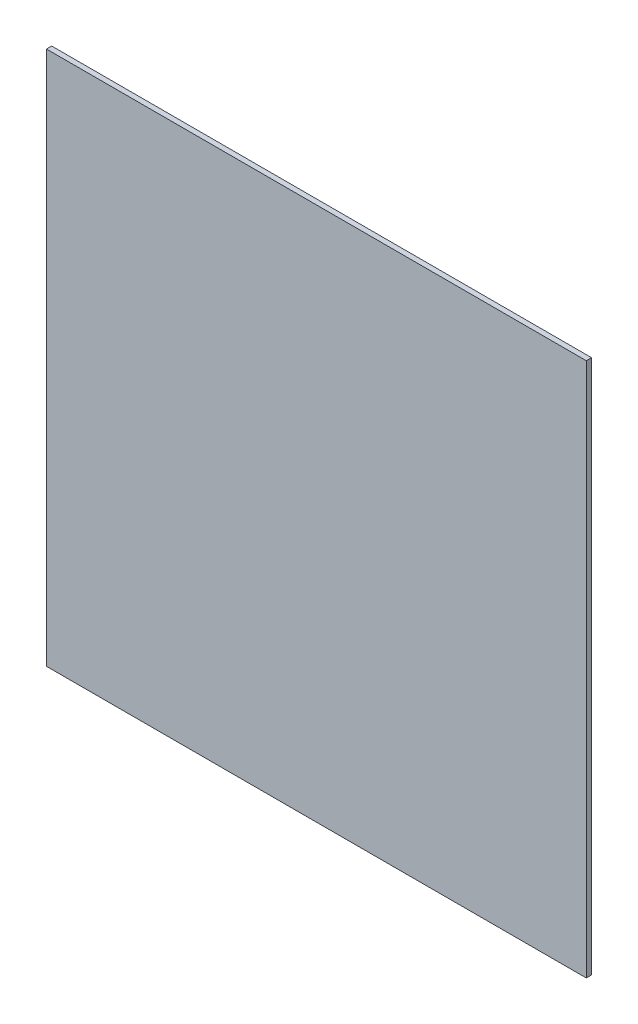
ISO-10303-21;
HEADER;
FILE_DESCRIPTION(('STEP AP214'),'2;1');
FILE_NAME('part.step','',(''),(''),'','','');
FILE_SCHEMA(('AUTOMOTIVE_DESIGN { 1 0 10303 214 1 1 1 1 }'));
ENDSEC;
DATA;
#1=APPLICATION_CONTEXT('core data for automotive mechanical design processes');
#2=APPLICATION_PROTOCOL_DEFINITION('international standard','automotive_design',2000,#1);
#3=PRODUCT_CONTEXT('',#1,'mechanical');
#4=PRODUCT('Part','Part','',(#3));
#5=PRODUCT_RELATED_PRODUCT_CATEGORY('part','',(#4));
#6=PRODUCT_DEFINITION_FORMATION('','',#4);
#7=PRODUCT_DEFINITION_CONTEXT('part definition',#1,'design');
#8=PRODUCT_DEFINITION('design','',#6,#7);
#9=PRODUCT_DEFINITION_SHAPE('','',#8);
#10=(LENGTH_UNIT() NAMED_UNIT(*) SI_UNIT(.MILLI.,.METRE.));
#11=(NAMED_UNIT(*) PLANE_ANGLE_UNIT() SI_UNIT($,.RADIAN.));
#12=(NAMED_UNIT(*) SI_UNIT($,.STERADIAN.) SOLID_ANGLE_UNIT());
#13=UNCERTAINTY_MEASURE_WITH_UNIT(LENGTH_MEASURE(1.E-05),#10,'distance_accuracy_value','');
#14=(GEOMETRIC_REPRESENTATION_CONTEXT(3) GLOBAL_UNCERTAINTY_ASSIGNED_CONTEXT((#13)) GLOBAL_UNIT_ASSIGNED_CONTEXT((#10,
#11,#12)) REPRESENTATION_CONTEXT('',''));
#15=CARTESIAN_POINT('',(0.,0.,0.));
#16=DIRECTION('',(0.,0.,1.));
#17=DIRECTION('',(1.,0.,0.));
#18=AXIS2_PLACEMENT_3D('',#15,#16,#17);
#19=CARTESIAN_POINT('',(0.,0.,1.));
#20=DIRECTION('',(-1.,0.,0.));
#21=DIRECTION('',(0.,0.,1.));
#22=AXIS2_PLACEMENT_3D('',#19,#20,#21);
#23=PLANE('',#22);
#24=DIRECTION('',(0.,1.,0.));
#25=VECTOR('',#24,1.);
#26=CARTESIAN_POINT('',(0.,0.,0.));
#27=LINE('',#26,#25);
#28=CARTESIAN_POINT('',(0.,0.,0.));
#29=VERTEX_POINT('',#28);
#30=CARTESIAN_POINT('',(0.,102.,0.));
#31=VERTEX_POINT('',#30);
#32=EDGE_CURVE('E96',#29,#31,#27,.T.);
#33=ORIENTED_EDGE('',*,*,#32,.T.);
#34=DIRECTION('',(0.,0.,-1.));
#35=VECTOR('',#34,1.);
#36=CARTESIAN_POINT('',(0.,102.,1.));
#37=LINE('',#36,#35);
#38=CARTESIAN_POINT('',(0.,102.,1.));
#39=VERTEX_POINT('',#38);
#40=EDGE_CURVE('E11',#39,#31,#37,.T.);
#41=ORIENTED_EDGE('',*,*,#40,.F.);
#42=DIRECTION('',(0.,1.,0.));
#43=VECTOR('',#42,1.);
#44=CARTESIAN_POINT('',(0.,0.,1.));
#45=LINE('',#44,#43);
#46=CARTESIAN_POINT('',(0.,0.,1.));
#47=VERTEX_POINT('',#46);
#48=EDGE_CURVE('E84',#47,#39,#45,.T.);
#49=ORIENTED_EDGE('',*,*,#48,.F.);
#50=DIRECTION('',(0.,0.,-1.));
#51=VECTOR('',#50,1.);
#52=CARTESIAN_POINT('',(0.,0.,1.));
#53=LINE('',#52,#51);
#54=EDGE_CURVE('E92',#47,#29,#53,.T.);
#55=ORIENTED_EDGE('',*,*,#54,.T.);
#56=EDGE_LOOP('',(#33,#41,#49,#55));
#57=FACE_BOUND('',#56,.T.);
#58=ADVANCED_FACE('F33',(#57),#23,.F.);
#59=CARTESIAN_POINT('',(0.,102.,1.));
#60=DIRECTION('',(0.,-1.,0.));
#61=DIRECTION('',(1.,0.,0.));
#62=AXIS2_PLACEMENT_3D('',#59,#60,#61);
#63=PLANE('',#62);
#64=DIRECTION('',(-1.,0.,0.));
#65=VECTOR('',#64,1.);
#66=CARTESIAN_POINT('',(0.,102.,0.));
#67=LINE('',#66,#65);
#68=CARTESIAN_POINT('',(-103.,102.,0.));
#69=VERTEX_POINT('',#68);
#70=EDGE_CURVE('E88',#31,#69,#67,.T.);
#71=ORIENTED_EDGE('',*,*,#70,.T.);
#72=DIRECTION('',(0.,0.,-1.));
#73=VECTOR('',#72,1.);
#74=CARTESIAN_POINT('',(-103.,102.,1.));
#75=LINE('',#74,#73);
#76=CARTESIAN_POINT('',(-103.,102.,1.));
#77=VERTEX_POINT('',#76);
#78=EDGE_CURVE('E41',#77,#69,#75,.T.);
#79=ORIENTED_EDGE('',*,*,#78,.F.);
#80=DIRECTION('',(-1.,0.,0.));
#81=VECTOR('',#80,1.);
#82=CARTESIAN_POINT('',(0.,102.,1.));
#83=LINE('',#82,#81);
#84=EDGE_CURVE('E79',#39,#77,#83,.T.);
#85=ORIENTED_EDGE('',*,*,#84,.F.);
#86=ORIENTED_EDGE('',*,*,#40,.T.);
#87=EDGE_LOOP('',(#71,#79,#85,#86));
#88=FACE_BOUND('',#87,.T.);
#89=ADVANCED_FACE('F87',(#88),#63,.F.);
#90=CARTESIAN_POINT('',(-103.,0.,1.));
#91=DIRECTION('',(1.,0.,0.));
#92=DIRECTION('',(0.,0.,-1.));
#93=AXIS2_PLACEMENT_3D('',#90,#91,#92);
#94=PLANE('',#93);
#95=DIRECTION('',(0.,-1.,0.));
#96=VECTOR('',#95,1.);
#97=CARTESIAN_POINT('',(-103.,0.,0.));
#98=LINE('',#97,#96);
#99=CARTESIAN_POINT('',(-103.,0.,0.));
#100=VERTEX_POINT('',#99);
#101=EDGE_CURVE('E66',#69,#100,#98,.T.);
#102=ORIENTED_EDGE('',*,*,#101,.T.);
#103=DIRECTION('',(0.,0.,-1.));
#104=VECTOR('',#103,1.);
#105=CARTESIAN_POINT('',(-103.,0.,1.));
#106=LINE('',#105,#104);
#107=CARTESIAN_POINT('',(-103.,0.,1.));
#108=VERTEX_POINT('',#107);
#109=EDGE_CURVE('E89',#108,#100,#106,.T.);
#110=ORIENTED_EDGE('',*,*,#109,.F.);
#111=DIRECTION('',(0.,-1.,0.));
#112=VECTOR('',#111,1.);
#113=CARTESIAN_POINT('',(-103.,0.,1.));
#114=LINE('',#113,#112);
#115=EDGE_CURVE('E82',#77,#108,#114,.T.);
#116=ORIENTED_EDGE('',*,*,#115,.F.);
#117=ORIENTED_EDGE('',*,*,#78,.T.);
#118=EDGE_LOOP('',(#102,#110,#116,#117));
#119=FACE_BOUND('',#118,.T.);
#120=ADVANCED_FACE('F90',(#119),#94,.F.);
#121=CARTESIAN_POINT('',(0.,0.,1.));
#122=DIRECTION('',(0.,1.,0.));
#123=DIRECTION('',(-1.,0.,0.));
#124=AXIS2_PLACEMENT_3D('',#121,#122,#123);
#125=PLANE('',#124);
#126=DIRECTION('',(1.,0.,0.));
#127=VECTOR('',#126,1.);
#128=CARTESIAN_POINT('',(0.,0.,0.));
#129=LINE('',#128,#127);
#130=EDGE_CURVE('E72',#100,#29,#129,.T.);
#131=ORIENTED_EDGE('',*,*,#130,.T.);
#132=ORIENTED_EDGE('',*,*,#54,.F.);
#133=DIRECTION('',(1.,0.,0.));
#134=VECTOR('',#133,1.);
#135=CARTESIAN_POINT('',(0.,0.,1.));
#136=LINE('',#135,#134);
#137=EDGE_CURVE('E49',#108,#47,#136,.T.);
#138=ORIENTED_EDGE('',*,*,#137,.F.);
#139=ORIENTED_EDGE('',*,*,#109,.T.);
#140=EDGE_LOOP('',(#131,#132,#138,#139));
#141=FACE_BOUND('',#140,.T.);
#142=ADVANCED_FACE('F103',(#141),#125,.F.);
#143=CARTESIAN_POINT('',(0.,0.,1.));
#144=DIRECTION('',(0.,0.,1.));
#145=DIRECTION('',(1.,0.,0.));
#146=AXIS2_PLACEMENT_3D('',#143,#144,#145);
#147=PLANE('',#146);
#148=ORIENTED_EDGE('',*,*,#48,.T.);
#149=ORIENTED_EDGE('',*,*,#84,.T.);
#150=ORIENTED_EDGE('',*,*,#115,.T.);
#151=ORIENTED_EDGE('',*,*,#137,.T.);
#152=EDGE_LOOP('',(#148,#149,#150,#151));
#153=FACE_BOUND('',#152,.T.);
#154=ADVANCED_FACE('F80',(#153),#147,.T.);
#155=CARTESIAN_POINT('',(0.,0.,0.));
#156=DIRECTION('',(0.,0.,1.));
#157=DIRECTION('',(1.,0.,0.));
#158=AXIS2_PLACEMENT_3D('',#155,#156,#157);
#159=PLANE('',#158);
#160=ORIENTED_EDGE('',*,*,#32,.F.);
#161=ORIENTED_EDGE('',*,*,#130,.F.);
#162=ORIENTED_EDGE('',*,*,#101,.F.);
#163=ORIENTED_EDGE('',*,*,#70,.F.);
#164=EDGE_LOOP('',(#160,#161,#162,#163));
#165=FACE_BOUND('',#164,.T.);
#166=ADVANCED_FACE('F106',(#165),#159,.F.);
#167=CLOSED_SHELL('',(#58,#89,#120,#142,#154,#166));
#168=MANIFOLD_SOLID_BREP('B2',#167);
#169=ADVANCED_BREP_SHAPE_REPRESENTATION('',(#18,#168),#14);
#170=SHAPE_DEFINITION_REPRESENTATION(#9,#169);
ENDSEC;
END-ISO-10303-21;
